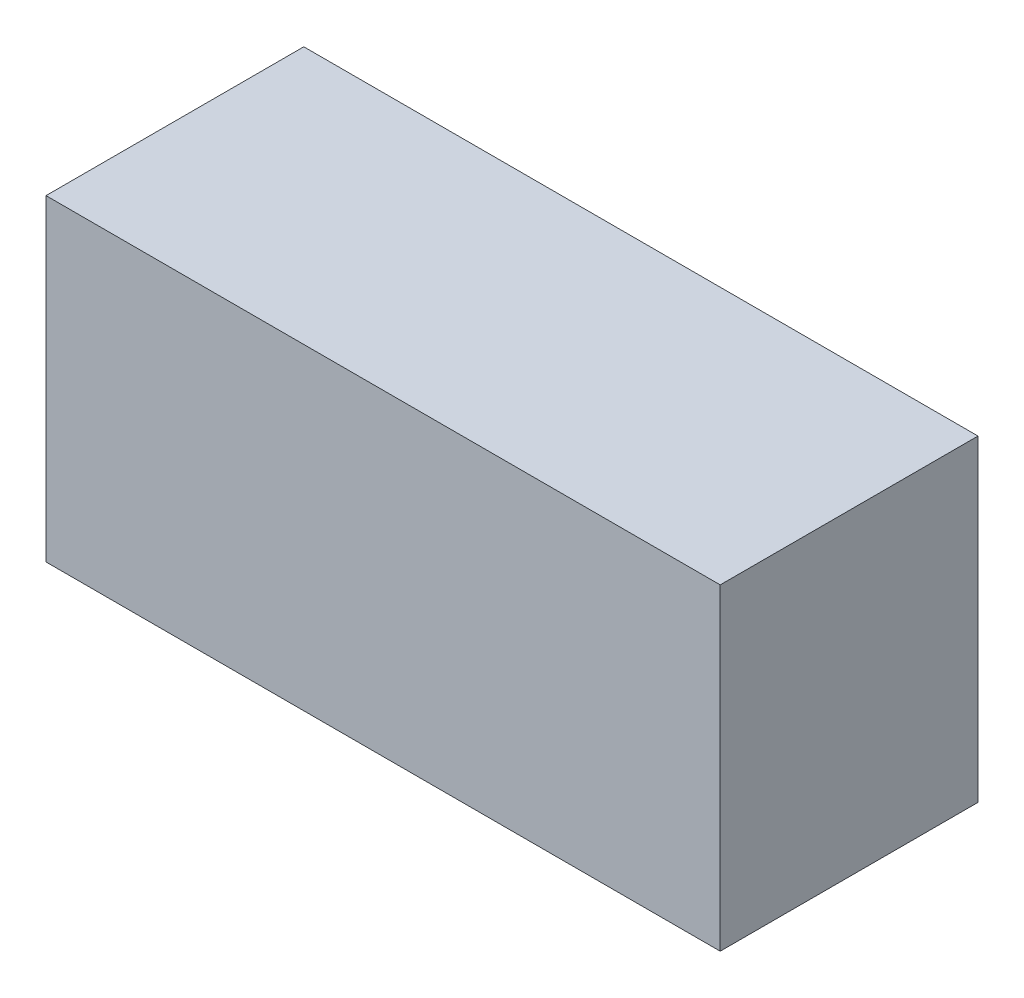
ISO-10303-21;
HEADER;
FILE_DESCRIPTION(('STEP AP214'),'2;1');
FILE_NAME('part.step','',(''),(''),'','','');
FILE_SCHEMA(('AUTOMOTIVE_DESIGN { 1 0 10303 214 1 1 1 1 }'));
ENDSEC;
DATA;
#1=APPLICATION_CONTEXT('core data for automotive mechanical design processes');
#2=APPLICATION_PROTOCOL_DEFINITION('international standard','automotive_design',2000,#1);
#3=PRODUCT_CONTEXT('',#1,'mechanical');
#4=PRODUCT('Part','Part','',(#3));
#5=PRODUCT_RELATED_PRODUCT_CATEGORY('part','',(#4));
#6=PRODUCT_DEFINITION_FORMATION('','',#4);
#7=PRODUCT_DEFINITION_CONTEXT('part definition',#1,'design');
#8=PRODUCT_DEFINITION('design','',#6,#7);
#9=PRODUCT_DEFINITION_SHAPE('','',#8);
#10=(LENGTH_UNIT() NAMED_UNIT(*) SI_UNIT(.MILLI.,.METRE.));
#11=(NAMED_UNIT(*) PLANE_ANGLE_UNIT() SI_UNIT($,.RADIAN.));
#12=(NAMED_UNIT(*) SI_UNIT($,.STERADIAN.) SOLID_ANGLE_UNIT());
#13=UNCERTAINTY_MEASURE_WITH_UNIT(LENGTH_MEASURE(1.E-05),#10,'distance_accuracy_value','');
#14=(GEOMETRIC_REPRESENTATION_CONTEXT(3) GLOBAL_UNCERTAINTY_ASSIGNED_CONTEXT((#13)) GLOBAL_UNIT_ASSIGNED_CONTEXT((#10,
#11,#12)) REPRESENTATION_CONTEXT('',''));
#15=CARTESIAN_POINT('',(0.,0.,0.));
#16=DIRECTION('',(0.,0.,1.));
#17=DIRECTION('',(1.,0.,0.));
#18=AXIS2_PLACEMENT_3D('',#15,#16,#17);
#19=CARTESIAN_POINT('',(0.175006000000003,0.399999200000001,0.6500114));
#20=DIRECTION('',(0.,-1.,0.));
#21=DIRECTION('',(0.,0.,-1.));
#22=AXIS2_PLACEMENT_3D('',#19,#20,#21);
#23=PLANE('',#22);
#24=DIRECTION('',(-1.,0.,0.));
#25=VECTOR('',#24,1.);
#26=CARTESIAN_POINT('',(0.175006000000003,0.399999200000001,0.));
#27=LINE('',#26,#25);
#28=CARTESIAN_POINT('',(1.8750026,0.399999200000001,0.));
#29=VERTEX_POINT('',#28);
#30=CARTESIAN_POINT('',(0.175006000000003,0.399999200000001,0.));
#31=VERTEX_POINT('',#30);
#32=EDGE_CURVE('E95',#29,#31,#27,.T.);
#33=ORIENTED_EDGE('',*,*,#32,.T.);
#34=DIRECTION('',(0.,0.,-1.));
#35=VECTOR('',#34,1.);
#36=CARTESIAN_POINT('',(0.175006000000003,0.399999200000001,0.6500114));
#37=LINE('',#36,#35);
#38=CARTESIAN_POINT('',(0.175006000000003,0.399999200000001,0.6500114));
#39=VERTEX_POINT('',#38);
#40=EDGE_CURVE('E11',#39,#31,#37,.T.);
#41=ORIENTED_EDGE('',*,*,#40,.F.);
#42=DIRECTION('',(-1.,0.,0.));
#43=VECTOR('',#42,1.);
#44=CARTESIAN_POINT('',(0.175006000000003,0.399999200000001,0.6500114));
#45=LINE('',#44,#43);
#46=CARTESIAN_POINT('',(1.8750026,0.399999200000001,0.6500114));
#47=VERTEX_POINT('',#46);
#48=EDGE_CURVE('E83',#47,#39,#45,.T.);
#49=ORIENTED_EDGE('',*,*,#48,.F.);
#50=DIRECTION('',(0.,0.,-1.));
#51=VECTOR('',#50,1.);
#52=CARTESIAN_POINT('',(1.8750026,0.399999200000001,0.6500114));
#53=LINE('',#52,#51);
#54=EDGE_CURVE('E91',#47,#29,#53,.T.);
#55=ORIENTED_EDGE('',*,*,#54,.T.);
#56=EDGE_LOOP('',(#33,#41,#49,#55));
#57=FACE_BOUND('',#56,.T.);
#58=ADVANCED_FACE('F32',(#57),#23,.F.);
#59=CARTESIAN_POINT('',(0.175006000000003,-0.399999200000001,0.6500114));
#60=DIRECTION('',(1.,0.,0.));
#61=DIRECTION('',(0.,0.,-1.));
#62=AXIS2_PLACEMENT_3D('',#59,#60,#61);
#63=PLANE('',#62);
#64=DIRECTION('',(0.,-1.,0.));
#65=VECTOR('',#64,1.);
#66=CARTESIAN_POINT('',(0.175006000000003,-0.399999200000001,0.));
#67=LINE('',#66,#65);
#68=CARTESIAN_POINT('',(0.175006000000003,-0.399999200000001,0.));
#69=VERTEX_POINT('',#68);
#70=EDGE_CURVE('E87',#31,#69,#67,.T.);
#71=ORIENTED_EDGE('',*,*,#70,.T.);
#72=DIRECTION('',(0.,0.,-1.));
#73=VECTOR('',#72,1.);
#74=CARTESIAN_POINT('',(0.175006000000003,-0.399999200000001,0.6500114));
#75=LINE('',#74,#73);
#76=CARTESIAN_POINT('',(0.175006000000003,-0.399999200000001,0.6500114));
#77=VERTEX_POINT('',#76);
#78=EDGE_CURVE('E40',#77,#69,#75,.T.);
#79=ORIENTED_EDGE('',*,*,#78,.F.);
#80=DIRECTION('',(0.,-1.,0.));
#81=VECTOR('',#80,1.);
#82=CARTESIAN_POINT('',(0.175006000000003,-0.399999200000001,0.6500114));
#83=LINE('',#82,#81);
#84=EDGE_CURVE('E78',#39,#77,#83,.T.);
#85=ORIENTED_EDGE('',*,*,#84,.F.);
#86=ORIENTED_EDGE('',*,*,#40,.T.);
#87=EDGE_LOOP('',(#71,#79,#85,#86));
#88=FACE_BOUND('',#87,.T.);
#89=ADVANCED_FACE('F86',(#88),#63,.F.);
#90=CARTESIAN_POINT('',(1.8750026,-0.399999200000001,0.6500114));
#91=DIRECTION('',(0.,1.,0.));
#92=DIRECTION('',(0.,0.,1.));
#93=AXIS2_PLACEMENT_3D('',#90,#91,#92);
#94=PLANE('',#93);
#95=DIRECTION('',(1.,0.,0.));
#96=VECTOR('',#95,1.);
#97=CARTESIAN_POINT('',(1.8750026,-0.399999200000001,0.));
#98=LINE('',#97,#96);
#99=CARTESIAN_POINT('',(1.8750026,-0.399999200000001,0.));
#100=VERTEX_POINT('',#99);
#101=EDGE_CURVE('E65',#69,#100,#98,.T.);
#102=ORIENTED_EDGE('',*,*,#101,.T.);
#103=DIRECTION('',(0.,0.,-1.));
#104=VECTOR('',#103,1.);
#105=CARTESIAN_POINT('',(1.8750026,-0.399999200000001,0.6500114));
#106=LINE('',#105,#104);
#107=CARTESIAN_POINT('',(1.8750026,-0.399999200000001,0.6500114));
#108=VERTEX_POINT('',#107);
#109=EDGE_CURVE('E88',#108,#100,#106,.T.);
#110=ORIENTED_EDGE('',*,*,#109,.F.);
#111=DIRECTION('',(1.,0.,0.));
#112=VECTOR('',#111,1.);
#113=CARTESIAN_POINT('',(1.8750026,-0.399999200000001,0.6500114));
#114=LINE('',#113,#112);
#115=EDGE_CURVE('E81',#77,#108,#114,.T.);
#116=ORIENTED_EDGE('',*,*,#115,.F.);
#117=ORIENTED_EDGE('',*,*,#78,.T.);
#118=EDGE_LOOP('',(#102,#110,#116,#117));
#119=FACE_BOUND('',#118,.T.);
#120=ADVANCED_FACE('F89',(#119),#94,.F.);
#121=CARTESIAN_POINT('',(1.8750026,0.399999200000001,0.6500114));
#122=DIRECTION('',(-1.,0.,0.));
#123=DIRECTION('',(0.,0.,1.));
#124=AXIS2_PLACEMENT_3D('',#121,#122,#123);
#125=PLANE('',#124);
#126=DIRECTION('',(0.,1.,0.));
#127=VECTOR('',#126,1.);
#128=CARTESIAN_POINT('',(1.8750026,0.399999200000001,0.));
#129=LINE('',#128,#127);
#130=EDGE_CURVE('E71',#100,#29,#129,.T.);
#131=ORIENTED_EDGE('',*,*,#130,.T.);
#132=ORIENTED_EDGE('',*,*,#54,.F.);
#133=DIRECTION('',(0.,1.,0.));
#134=VECTOR('',#133,1.);
#135=CARTESIAN_POINT('',(1.8750026,0.399999200000001,0.6500114));
#136=LINE('',#135,#134);
#137=EDGE_CURVE('E48',#108,#47,#136,.T.);
#138=ORIENTED_EDGE('',*,*,#137,.F.);
#139=ORIENTED_EDGE('',*,*,#109,.T.);
#140=EDGE_LOOP('',(#131,#132,#138,#139));
#141=FACE_BOUND('',#140,.T.);
#142=ADVANCED_FACE('F102',(#141),#125,.F.);
#143=CARTESIAN_POINT('',(0.,0.,0.6500114));
#144=DIRECTION('',(0.,0.,-1.));
#145=DIRECTION('',(-1.,0.,0.));
#146=AXIS2_PLACEMENT_3D('',#143,#144,#145);
#147=PLANE('',#146);
#148=ORIENTED_EDGE('',*,*,#48,.T.);
#149=ORIENTED_EDGE('',*,*,#84,.T.);
#150=ORIENTED_EDGE('',*,*,#115,.T.);
#151=ORIENTED_EDGE('',*,*,#137,.T.);
#152=EDGE_LOOP('',(#148,#149,#150,#151));
#153=FACE_BOUND('',#152,.T.);
#154=ADVANCED_FACE('F79',(#153),#147,.F.);
#155=CARTESIAN_POINT('',(0.,0.,0.));
#156=DIRECTION('',(0.,0.,-1.));
#157=DIRECTION('',(-1.,0.,0.));
#158=AXIS2_PLACEMENT_3D('',#155,#156,#157);
#159=PLANE('',#158);
#160=ORIENTED_EDGE('',*,*,#32,.F.);
#161=ORIENTED_EDGE('',*,*,#130,.F.);
#162=ORIENTED_EDGE('',*,*,#101,.F.);
#163=ORIENTED_EDGE('',*,*,#70,.F.);
#164=EDGE_LOOP('',(#160,#161,#162,#163));
#165=FACE_BOUND('',#164,.T.);
#166=ADVANCED_FACE('F105',(#165),#159,.T.);
#167=CLOSED_SHELL('',(#58,#89,#120,#142,#154,#166));
#168=MANIFOLD_SOLID_BREP('B2',#167);
#169=ADVANCED_BREP_SHAPE_REPRESENTATION('',(#18,#168),#14);
#170=SHAPE_DEFINITION_REPRESENTATION(#9,#169);
ENDSEC;
END-ISO-10303-21;
